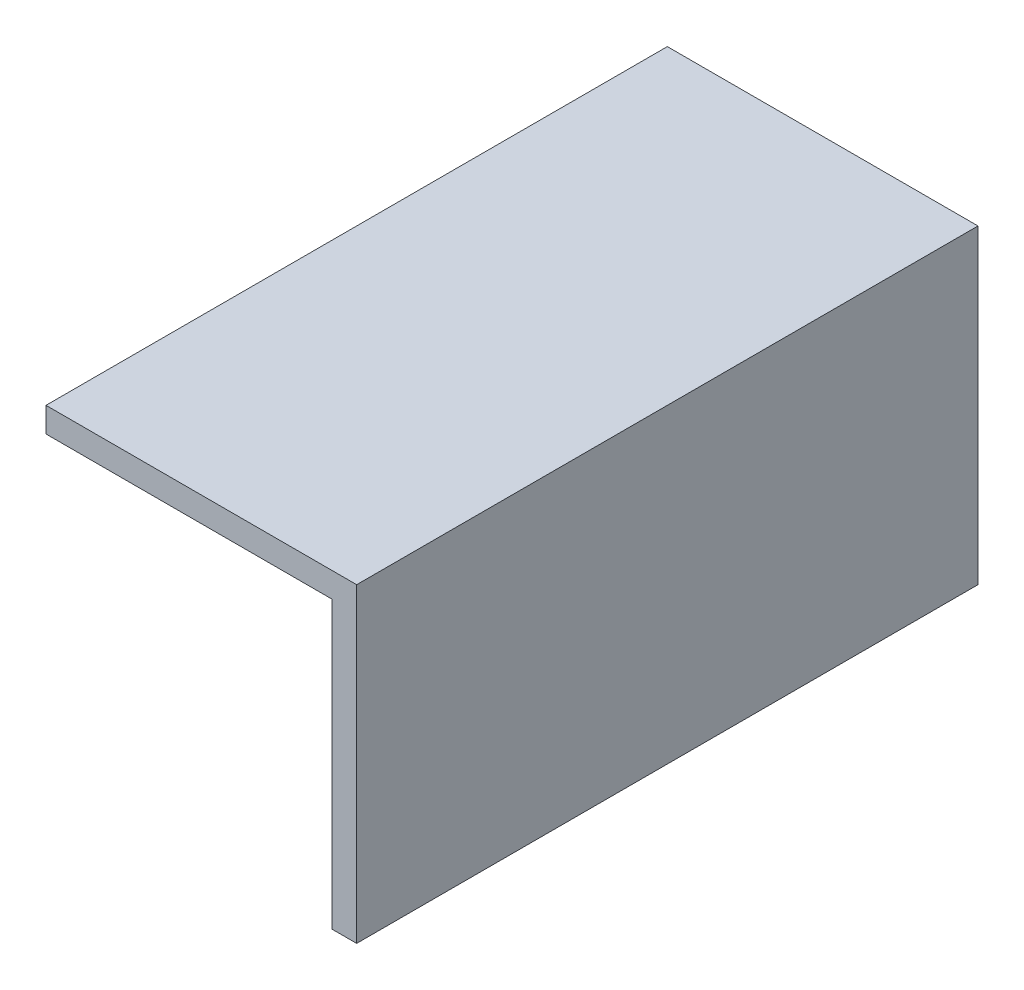
ISO-10303-21;
HEADER;
FILE_DESCRIPTION(('STEP AP214'),'2;1');
FILE_NAME('part.step','',(''),(''),'','','');
FILE_SCHEMA(('AUTOMOTIVE_DESIGN { 1 0 10303 214 1 1 1 1 }'));
ENDSEC;
DATA;
#1=APPLICATION_CONTEXT('core data for automotive mechanical design processes');
#2=APPLICATION_PROTOCOL_DEFINITION('international standard','automotive_design',2000,#1);
#3=PRODUCT_CONTEXT('',#1,'mechanical');
#4=PRODUCT('Part','Part','',(#3));
#5=PRODUCT_RELATED_PRODUCT_CATEGORY('part','',(#4));
#6=PRODUCT_DEFINITION_FORMATION('','',#4);
#7=PRODUCT_DEFINITION_CONTEXT('part definition',#1,'design');
#8=PRODUCT_DEFINITION('design','',#6,#7);
#9=PRODUCT_DEFINITION_SHAPE('','',#8);
#10=(LENGTH_UNIT() NAMED_UNIT(*) SI_UNIT(.MILLI.,.METRE.));
#11=(NAMED_UNIT(*) PLANE_ANGLE_UNIT() SI_UNIT($,.RADIAN.));
#12=(NAMED_UNIT(*) SI_UNIT($,.STERADIAN.) SOLID_ANGLE_UNIT());
#13=UNCERTAINTY_MEASURE_WITH_UNIT(LENGTH_MEASURE(1.E-05),#10,'distance_accuracy_value','');
#14=(GEOMETRIC_REPRESENTATION_CONTEXT(3) GLOBAL_UNCERTAINTY_ASSIGNED_CONTEXT((#13)) GLOBAL_UNIT_ASSIGNED_CONTEXT((#10,
#11,#12)) REPRESENTATION_CONTEXT('',''));
#15=CARTESIAN_POINT('',(0.,0.,0.));
#16=DIRECTION('',(0.,0.,1.));
#17=DIRECTION('',(1.,0.,0.));
#18=AXIS2_PLACEMENT_3D('',#15,#16,#17);
#19=CARTESIAN_POINT('',(-124.610735746152,44.9639966273187,100.));
#20=DIRECTION('',(1.,0.,0.));
#21=DIRECTION('',(0.,0.,-1.));
#22=AXIS2_PLACEMENT_3D('',#19,#20,#21);
#23=PLANE('',#22);
#24=DIRECTION('',(0.,-1.,0.));
#25=VECTOR('',#24,1.);
#26=CARTESIAN_POINT('',(-124.610735746152,44.9639966273187,0.));
#27=LINE('',#26,#25);
#28=CARTESIAN_POINT('',(-124.610735746152,44.9639966273187,0.));
#29=VERTEX_POINT('',#28);
#30=CARTESIAN_POINT('',(-124.610735746152,40.9639966273187,0.));
#31=VERTEX_POINT('',#30);
#32=EDGE_CURVE('E116',#29,#31,#27,.T.);
#33=ORIENTED_EDGE('',*,*,#32,.T.);
#34=DIRECTION('',(0.,0.,-1.));
#35=VECTOR('',#34,1.);
#36=CARTESIAN_POINT('',(-124.610735746152,40.9639966273187,100.));
#37=LINE('',#36,#35);
#38=CARTESIAN_POINT('',(-124.610735746152,40.9639966273187,100.));
#39=VERTEX_POINT('',#38);
#40=EDGE_CURVE('E11',#39,#31,#37,.T.);
#41=ORIENTED_EDGE('',*,*,#40,.F.);
#42=DIRECTION('',(0.,-1.,0.));
#43=VECTOR('',#42,1.);
#44=CARTESIAN_POINT('',(-124.610735746152,44.9639966273187,100.));
#45=LINE('',#44,#43);
#46=CARTESIAN_POINT('',(-124.610735746152,44.9639966273187,100.));
#47=VERTEX_POINT('',#46);
#48=EDGE_CURVE('E126',#47,#39,#45,.T.);
#49=ORIENTED_EDGE('',*,*,#48,.F.);
#50=DIRECTION('',(0.,0.,-1.));
#51=VECTOR('',#50,1.);
#52=CARTESIAN_POINT('',(-124.610735746152,44.9639966273187,100.));
#53=LINE('',#52,#51);
#54=EDGE_CURVE('E112',#47,#29,#53,.T.);
#55=ORIENTED_EDGE('',*,*,#54,.T.);
#56=EDGE_LOOP('',(#33,#41,#49,#55));
#57=FACE_BOUND('',#56,.T.);
#58=ADVANCED_FACE('F32',(#57),#23,.F.);
#59=CARTESIAN_POINT('',(-124.610735746152,40.9639966273187,100.));
#60=DIRECTION('',(0.,1.,0.));
#61=DIRECTION('',(0.,0.,1.));
#62=AXIS2_PLACEMENT_3D('',#59,#60,#61);
#63=PLANE('',#62);
#64=DIRECTION('',(1.,0.,0.));
#65=VECTOR('',#64,1.);
#66=CARTESIAN_POINT('',(-124.610735746152,40.9639966273187,0.));
#67=LINE('',#66,#65);
#68=CARTESIAN_POINT('',(-78.6107357461524,40.9639966273187,0.));
#69=VERTEX_POINT('',#68);
#70=EDGE_CURVE('E119',#31,#69,#67,.T.);
#71=ORIENTED_EDGE('',*,*,#70,.T.);
#72=DIRECTION('',(0.,0.,-1.));
#73=VECTOR('',#72,1.);
#74=CARTESIAN_POINT('',(-78.6107357461524,40.9639966273187,100.));
#75=LINE('',#74,#73);
#76=CARTESIAN_POINT('',(-78.6107357461524,40.9639966273187,100.));
#77=VERTEX_POINT('',#76);
#78=EDGE_CURVE('E40',#77,#69,#75,.T.);
#79=ORIENTED_EDGE('',*,*,#78,.F.);
#80=DIRECTION('',(1.,0.,0.));
#81=VECTOR('',#80,1.);
#82=CARTESIAN_POINT('',(-124.610735746152,40.9639966273187,100.));
#83=LINE('',#82,#81);
#84=EDGE_CURVE('E85',#39,#77,#83,.T.);
#85=ORIENTED_EDGE('',*,*,#84,.F.);
#86=ORIENTED_EDGE('',*,*,#40,.T.);
#87=EDGE_LOOP('',(#71,#79,#85,#86));
#88=FACE_BOUND('',#87,.T.);
#89=ADVANCED_FACE('F150',(#88),#63,.F.);
#90=CARTESIAN_POINT('',(-78.6107357461524,40.9639966273187,100.));
#91=DIRECTION('',(1.,0.,0.));
#92=DIRECTION('',(0.,0.,-1.));
#93=AXIS2_PLACEMENT_3D('',#90,#91,#92);
#94=PLANE('',#93);
#95=DIRECTION('',(0.,-1.,0.));
#96=VECTOR('',#95,1.);
#97=CARTESIAN_POINT('',(-78.6107357461524,40.9639966273187,0.));
#98=LINE('',#97,#96);
#99=CARTESIAN_POINT('',(-78.6107357461524,-5.03600337268127,0.));
#100=VERTEX_POINT('',#99);
#101=EDGE_CURVE('E121',#69,#100,#98,.T.);
#102=ORIENTED_EDGE('',*,*,#101,.T.);
#103=DIRECTION('',(0.,0.,-1.));
#104=VECTOR('',#103,1.);
#105=CARTESIAN_POINT('',(-78.6107357461524,-5.03600337268127,100.));
#106=LINE('',#105,#104);
#107=CARTESIAN_POINT('',(-78.6107357461524,-5.03600337268127,100.));
#108=VERTEX_POINT('',#107);
#109=EDGE_CURVE('E107',#108,#100,#106,.T.);
#110=ORIENTED_EDGE('',*,*,#109,.F.);
#111=DIRECTION('',(0.,-1.,0.));
#112=VECTOR('',#111,1.);
#113=CARTESIAN_POINT('',(-78.6107357461524,40.9639966273187,100.));
#114=LINE('',#113,#112);
#115=EDGE_CURVE('E98',#77,#108,#114,.T.);
#116=ORIENTED_EDGE('',*,*,#115,.F.);
#117=ORIENTED_EDGE('',*,*,#78,.T.);
#118=EDGE_LOOP('',(#102,#110,#116,#117));
#119=FACE_BOUND('',#118,.T.);
#120=ADVANCED_FACE('F132',(#119),#94,.F.);
#121=CARTESIAN_POINT('',(-78.6107357461524,-5.03600337268127,100.));
#122=DIRECTION('',(0.,1.,0.));
#123=DIRECTION('',(0.,0.,1.));
#124=AXIS2_PLACEMENT_3D('',#121,#122,#123);
#125=PLANE('',#124);
#126=DIRECTION('',(1.,0.,0.));
#127=VECTOR('',#126,1.);
#128=CARTESIAN_POINT('',(-78.6107357461524,-5.03600337268127,0.));
#129=LINE('',#128,#127);
#130=CARTESIAN_POINT('',(-74.6107357461524,-5.03600337268127,0.));
#131=VERTEX_POINT('',#130);
#132=EDGE_CURVE('E106',#100,#131,#129,.T.);
#133=ORIENTED_EDGE('',*,*,#132,.T.);
#134=DIRECTION('',(0.,0.,-1.));
#135=VECTOR('',#134,1.);
#136=CARTESIAN_POINT('',(-74.6107357461524,-5.03600337268127,100.));
#137=LINE('',#136,#135);
#138=CARTESIAN_POINT('',(-74.6107357461524,-5.03600337268127,100.));
#139=VERTEX_POINT('',#138);
#140=EDGE_CURVE('E103',#139,#131,#137,.T.);
#141=ORIENTED_EDGE('',*,*,#140,.F.);
#142=DIRECTION('',(1.,0.,0.));
#143=VECTOR('',#142,1.);
#144=CARTESIAN_POINT('',(-78.6107357461524,-5.03600337268127,100.));
#145=LINE('',#144,#143);
#146=EDGE_CURVE('E92',#108,#139,#145,.T.);
#147=ORIENTED_EDGE('',*,*,#146,.F.);
#148=ORIENTED_EDGE('',*,*,#109,.T.);
#149=EDGE_LOOP('',(#133,#141,#147,#148));
#150=FACE_BOUND('',#149,.T.);
#151=ADVANCED_FACE('F104',(#150),#125,.F.);
#152=CARTESIAN_POINT('',(-74.6107357461524,44.9639966273187,100.));
#153=DIRECTION('',(-1.,0.,0.));
#154=DIRECTION('',(0.,0.,1.));
#155=AXIS2_PLACEMENT_3D('',#152,#153,#154);
#156=PLANE('',#155);
#157=DIRECTION('',(0.,1.,0.));
#158=VECTOR('',#157,1.);
#159=CARTESIAN_POINT('',(-74.6107357461524,44.9639966273187,0.));
#160=LINE('',#159,#158);
#161=CARTESIAN_POINT('',(-74.6107357461524,44.9639966273187,0.));
#162=VERTEX_POINT('',#161);
#163=EDGE_CURVE('E71',#131,#162,#160,.T.);
#164=ORIENTED_EDGE('',*,*,#163,.T.);
#165=DIRECTION('',(0.,0.,-1.));
#166=VECTOR('',#165,1.);
#167=CARTESIAN_POINT('',(-74.6107357461524,44.9639966273187,100.));
#168=LINE('',#167,#166);
#169=CARTESIAN_POINT('',(-74.6107357461524,44.9639966273187,100.));
#170=VERTEX_POINT('',#169);
#171=EDGE_CURVE('E108',#170,#162,#168,.T.);
#172=ORIENTED_EDGE('',*,*,#171,.F.);
#173=DIRECTION('',(0.,1.,0.));
#174=VECTOR('',#173,1.);
#175=CARTESIAN_POINT('',(-74.6107357461524,44.9639966273187,100.));
#176=LINE('',#175,#174);
#177=EDGE_CURVE('E96',#139,#170,#176,.T.);
#178=ORIENTED_EDGE('',*,*,#177,.F.);
#179=ORIENTED_EDGE('',*,*,#140,.T.);
#180=EDGE_LOOP('',(#164,#172,#178,#179));
#181=FACE_BOUND('',#180,.T.);
#182=ADVANCED_FACE('F110',(#181),#156,.F.);
#183=CARTESIAN_POINT('',(-124.610735746152,44.9639966273187,100.));
#184=DIRECTION('',(0.,-1.,0.));
#185=DIRECTION('',(0.,0.,-1.));
#186=AXIS2_PLACEMENT_3D('',#183,#184,#185);
#187=PLANE('',#186);
#188=DIRECTION('',(-1.,0.,0.));
#189=VECTOR('',#188,1.);
#190=CARTESIAN_POINT('',(-124.610735746152,44.9639966273187,0.));
#191=LINE('',#190,#189);
#192=EDGE_CURVE('E77',#162,#29,#191,.T.);
#193=ORIENTED_EDGE('',*,*,#192,.T.);
#194=ORIENTED_EDGE('',*,*,#54,.F.);
#195=DIRECTION('',(-1.,0.,0.));
#196=VECTOR('',#195,1.);
#197=CARTESIAN_POINT('',(-124.610735746152,44.9639966273187,100.));
#198=LINE('',#197,#196);
#199=EDGE_CURVE('E48',#170,#47,#198,.T.);
#200=ORIENTED_EDGE('',*,*,#199,.F.);
#201=ORIENTED_EDGE('',*,*,#171,.T.);
#202=EDGE_LOOP('',(#193,#194,#200,#201));
#203=FACE_BOUND('',#202,.T.);
#204=ADVANCED_FACE('F139',(#203),#187,.F.);
#205=CARTESIAN_POINT('',(-124.610735746152,40.9639966273187,100.));
#206=DIRECTION('',(0.,0.,1.));
#207=DIRECTION('',(1.,0.,0.));
#208=AXIS2_PLACEMENT_3D('',#205,#206,#207);
#209=PLANE('',#208);
#210=ORIENTED_EDGE('',*,*,#48,.T.);
#211=ORIENTED_EDGE('',*,*,#84,.T.);
#212=ORIENTED_EDGE('',*,*,#115,.T.);
#213=ORIENTED_EDGE('',*,*,#146,.T.);
#214=ORIENTED_EDGE('',*,*,#177,.T.);
#215=ORIENTED_EDGE('',*,*,#199,.T.);
#216=EDGE_LOOP('',(#210,#211,#212,#213,#214,#215));
#217=FACE_BOUND('',#216,.T.);
#218=ADVANCED_FACE('F94',(#217),#209,.T.);
#219=CARTESIAN_POINT('',(-124.610735746152,40.9639966273187,0.));
#220=DIRECTION('',(0.,0.,1.));
#221=DIRECTION('',(1.,0.,0.));
#222=AXIS2_PLACEMENT_3D('',#219,#220,#221);
#223=PLANE('',#222);
#224=ORIENTED_EDGE('',*,*,#32,.F.);
#225=ORIENTED_EDGE('',*,*,#192,.F.);
#226=ORIENTED_EDGE('',*,*,#163,.F.);
#227=ORIENTED_EDGE('',*,*,#132,.F.);
#228=ORIENTED_EDGE('',*,*,#101,.F.);
#229=ORIENTED_EDGE('',*,*,#70,.F.);
#230=EDGE_LOOP('',(#224,#225,#226,#227,#228,#229));
#231=FACE_BOUND('',#230,.T.);
#232=ADVANCED_FACE('F135',(#231),#223,.F.);
#233=CLOSED_SHELL('',(#58,#89,#120,#151,#182,#204,#218,#232));
#234=MANIFOLD_SOLID_BREP('B2',#233);
#235=ADVANCED_BREP_SHAPE_REPRESENTATION('',(#18,#234),#14);
#236=SHAPE_DEFINITION_REPRESENTATION(#9,#235);
ENDSEC;
END-ISO-10303-21;
